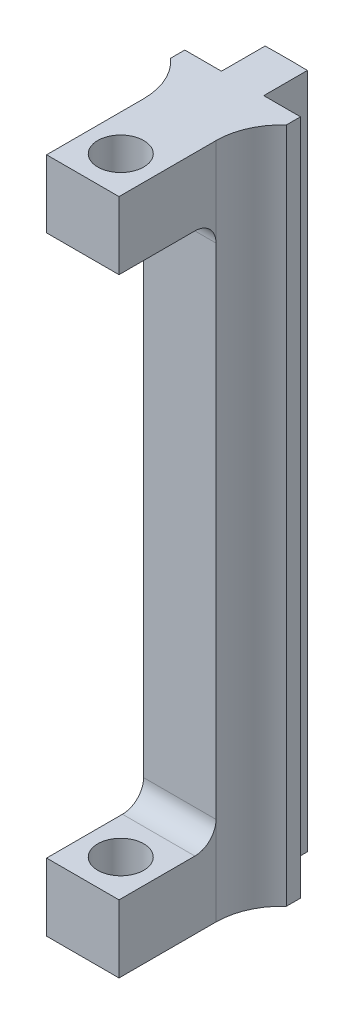
ISO-10303-21;
HEADER;
FILE_DESCRIPTION(('STEP AP214'),'2;1');
FILE_NAME('part.step','',(''),(''),'','','');
FILE_SCHEMA(('AUTOMOTIVE_DESIGN { 1 0 10303 214 1 1 1 1 }'));
ENDSEC;
DATA;
#1=APPLICATION_CONTEXT('core data for automotive mechanical design processes');
#2=APPLICATION_PROTOCOL_DEFINITION('international standard','automotive_design',2000,#1);
#3=PRODUCT_CONTEXT('',#1,'mechanical');
#4=PRODUCT('Part','Part','',(#3));
#5=PRODUCT_RELATED_PRODUCT_CATEGORY('part','',(#4));
#6=PRODUCT_DEFINITION_FORMATION('','',#4);
#7=PRODUCT_DEFINITION_CONTEXT('part definition',#1,'design');
#8=PRODUCT_DEFINITION('design','',#6,#7);
#9=PRODUCT_DEFINITION_SHAPE('','',#8);
#10=(LENGTH_UNIT() NAMED_UNIT(*) SI_UNIT(.MILLI.,.METRE.));
#11=(NAMED_UNIT(*) PLANE_ANGLE_UNIT() SI_UNIT($,.RADIAN.));
#12=(NAMED_UNIT(*) SI_UNIT($,.STERADIAN.) SOLID_ANGLE_UNIT());
#13=UNCERTAINTY_MEASURE_WITH_UNIT(LENGTH_MEASURE(1.E-05),#10,'distance_accuracy_value','');
#14=(GEOMETRIC_REPRESENTATION_CONTEXT(3) GLOBAL_UNCERTAINTY_ASSIGNED_CONTEXT((#13)) GLOBAL_UNIT_ASSIGNED_CONTEXT((#10,
#11,#12)) REPRESENTATION_CONTEXT('',''));
#15=CARTESIAN_POINT('',(0.,0.,0.));
#16=DIRECTION('',(0.,0.,1.));
#17=DIRECTION('',(1.,0.,0.));
#18=AXIS2_PLACEMENT_3D('',#15,#16,#17);
#19=CARTESIAN_POINT('',(-2.71812436418949,-50.8,-75.8154529033946));
#20=DIRECTION('',(0.,0.,1.));
#21=DIRECTION('',(1.,0.,0.));
#22=AXIS2_PLACEMENT_3D('',#19,#20,#21);
#23=PLANE('',#22);
#24=DIRECTION('',(0.,1.,0.));
#25=VECTOR('',#24,1.);
#26=CARTESIAN_POINT('',(-2.71812436418949,-50.8,-75.8154529033946));
#27=LINE('',#26,#25);
#28=CARTESIAN_POINT('',(-2.71812436418949,-44.1325,-75.8154529033946));
#29=VERTEX_POINT('',#28);
#30=CARTESIAN_POINT('',(-2.71812436418949,-6.6675,-75.8154529033946));
#31=VERTEX_POINT('',#30);
#32=EDGE_CURVE('E273',#29,#31,#27,.T.);
#33=ORIENTED_EDGE('',*,*,#32,.F.);
#34=DIRECTION('',(-1.,0.,0.));
#35=VECTOR('',#34,1.);
#36=CARTESIAN_POINT('',(2.71812436418949,-44.1325,-75.8154529033946));
#37=LINE('',#36,#35);
#38=CARTESIAN_POINT('',(2.71812436418949,-44.1325,-75.8154529033946));
#39=VERTEX_POINT('',#38);
#40=EDGE_CURVE('E302',#29,#39,#37,.F.);
#41=ORIENTED_EDGE('',*,*,#40,.T.);
#42=DIRECTION('',(0.,1.,0.));
#43=VECTOR('',#42,1.);
#44=CARTESIAN_POINT('',(2.71812436418949,-50.8,-75.8154529033946));
#45=LINE('',#44,#43);
#46=CARTESIAN_POINT('',(2.71812436418949,-6.6675,-75.8154529033946));
#47=VERTEX_POINT('',#46);
#48=EDGE_CURVE('E283',#39,#47,#45,.T.);
#49=ORIENTED_EDGE('',*,*,#48,.T.);
#50=DIRECTION('',(-1.,0.,0.));
#51=VECTOR('',#50,1.);
#52=CARTESIAN_POINT('',(-2.71812436418949,-6.6675,-75.8154529033946));
#53=LINE('',#52,#51);
#54=EDGE_CURVE('E290',#47,#31,#53,.T.);
#55=ORIENTED_EDGE('',*,*,#54,.T.);
#56=EDGE_LOOP('',(#33,#41,#49,#55));
#57=FACE_BOUND('',#56,.T.);
#58=ADVANCED_FACE('F33',(#57),#23,.T.);
#59=CARTESIAN_POINT('',(-7.64572436418949,-50.8,-75.8154529033946));
#60=DIRECTION('',(0.,1.,0.));
#61=DIRECTION('',(0.,0.,1.));
#62=AXIS2_PLACEMENT_3D('',#59,#60,#61);
#63=CYLINDRICAL_SURFACE('',#62,4.9276);
#64=CARTESIAN_POINT('',(-7.64572436418949,0.,-75.8154529033946));
#65=DIRECTION('',(0.,-1.,0.));
#66=DIRECTION('',(0.,0.,1.));
#67=AXIS2_PLACEMENT_3D('',#64,#65,#66);
#68=CIRCLE('',#67,4.9276);
#69=CARTESIAN_POINT('',(-4.34080980571586,0.,-79.4704195956079));
#70=VERTEX_POINT('',#69);
#71=CARTESIAN_POINT('',(-2.71812436418949,0.,-75.8154529033946));
#72=VERTEX_POINT('',#71);
#73=EDGE_CURVE('E269',#70,#72,#68,.T.);
#74=ORIENTED_EDGE('',*,*,#73,.F.);
#75=DIRECTION('',(0.,1.,0.));
#76=VECTOR('',#75,1.);
#77=CARTESIAN_POINT('',(-4.34080980571586,-50.8,-79.4704195956079));
#78=LINE('',#77,#76);
#79=CARTESIAN_POINT('',(-4.34080980571586,-50.8,-79.4704195956079));
#80=VERTEX_POINT('',#79);
#81=EDGE_CURVE('E255',#70,#80,#78,.F.);
#82=ORIENTED_EDGE('',*,*,#81,.T.);
#83=CARTESIAN_POINT('',(-7.64572436418949,-50.8,-75.8154529033946));
#84=DIRECTION('',(0.,-1.,0.));
#85=DIRECTION('',(0.,0.,1.));
#86=AXIS2_PLACEMENT_3D('',#83,#84,#85);
#87=CIRCLE('',#86,4.9276);
#88=CARTESIAN_POINT('',(-2.71812436418949,-50.8,-75.8154529033946));
#89=VERTEX_POINT('',#88);
#90=EDGE_CURVE('E271',#80,#89,#87,.T.);
#91=ORIENTED_EDGE('',*,*,#90,.T.);
#92=EDGE_CURVE('E49',#89,#29,#27,.T.);
#93=ORIENTED_EDGE('',*,*,#92,.T.);
#94=ORIENTED_EDGE('',*,*,#32,.T.);
#95=DIRECTION('',(0.,1.,0.));
#96=VECTOR('',#95,1.);
#97=CARTESIAN_POINT('',(-2.71812436418949,-5.08,-75.8154529033946));
#98=LINE('',#97,#96);
#99=EDGE_CURVE('E214',#31,#72,#98,.T.);
#100=ORIENTED_EDGE('',*,*,#99,.T.);
#101=EDGE_LOOP('',(#74,#82,#91,#93,#94,#100));
#102=FACE_BOUND('',#101,.T.);
#103=ADVANCED_FACE('F343',(#102),#63,.F.);
#104=CARTESIAN_POINT('',(0.,-50.8,0.));
#105=DIRECTION('',(0.,1.,0.));
#106=DIRECTION('',(0.,0.,1.));
#107=AXIS2_PLACEMENT_3D('',#104,#105,#106);
#108=CYLINDRICAL_SURFACE('',#107,83.82);
#109=CARTESIAN_POINT('',(0.,-50.8,0.));
#110=DIRECTION('',(0.,1.,0.));
#111=DIRECTION('',(0.,0.,1.));
#112=AXIS2_PLACEMENT_3D('',#109,#110,#111);
#113=CIRCLE('',#112,83.82);
#114=CARTESIAN_POINT('',(1.5875,-50.8,-83.8049655077192));
#115=VERTEX_POINT('',#114);
#116=CARTESIAN_POINT('',(-1.5875,-50.8,-83.8049655077192));
#117=VERTEX_POINT('',#116);
#118=EDGE_CURVE('E268',#115,#117,#113,.T.);
#119=ORIENTED_EDGE('',*,*,#118,.T.);
#120=DIRECTION('',(0.,1.,0.));
#121=VECTOR('',#120,1.);
#122=CARTESIAN_POINT('',(-1.5875,-50.8,-83.8049655077192));
#123=LINE('',#122,#121);
#124=CARTESIAN_POINT('',(-1.5875,0.,-83.8049655077192));
#125=VERTEX_POINT('',#124);
#126=EDGE_CURVE('E262',#117,#125,#123,.T.);
#127=ORIENTED_EDGE('',*,*,#126,.T.);
#128=CARTESIAN_POINT('',(0.,0.,0.));
#129=DIRECTION('',(0.,1.,0.));
#130=DIRECTION('',(0.,0.,1.));
#131=AXIS2_PLACEMENT_3D('',#128,#129,#130);
#132=CIRCLE('',#131,83.82);
#133=CARTESIAN_POINT('',(1.5875,0.,-83.8049655077192));
#134=VERTEX_POINT('',#133);
#135=EDGE_CURVE('E276',#134,#125,#132,.T.);
#136=ORIENTED_EDGE('',*,*,#135,.F.);
#137=DIRECTION('',(0.,1.,0.));
#138=VECTOR('',#137,1.);
#139=CARTESIAN_POINT('',(1.5875,-50.8,-83.8049655077192));
#140=LINE('',#139,#138);
#141=EDGE_CURVE('E238',#115,#134,#140,.T.);
#142=ORIENTED_EDGE('',*,*,#141,.F.);
#143=EDGE_LOOP('',(#119,#127,#136,#142));
#144=FACE_BOUND('',#143,.T.);
#145=ADVANCED_FACE('F374',(#144),#108,.T.);
#146=CARTESIAN_POINT('',(7.64572436418949,-50.8,-75.8154529033946));
#147=DIRECTION('',(0.,-1.,0.));
#148=DIRECTION('',(0.,0.,-1.));
#149=AXIS2_PLACEMENT_3D('',#146,#147,#148);
#150=PLANE('',#149);
#151=CARTESIAN_POINT('',(0.,-50.8,-71.3797296215661));
#152=DIRECTION('',(0.,1.,0.));
#153=DIRECTION('',(0.,0.,1.));
#154=AXIS2_PLACEMENT_3D('',#151,#152,#153);
#155=CIRCLE('',#154,1.72719999999999);
#156=CARTESIAN_POINT('',(0.,-50.8,-69.6525296215661));
#157=VERTEX_POINT('',#156);
#158=EDGE_CURVE('E440',#157,#157,#155,.T.);
#159=ORIENTED_EDGE('',*,*,#158,.T.);
#160=EDGE_LOOP('',(#159));
#161=FACE_BOUND('',#160,.T.);
#162=DIRECTION('',(0.,0.,-1.));
#163=VECTOR('',#162,1.);
#164=CARTESIAN_POINT('',(1.5875,-50.8,-75.8154529033946));
#165=LINE('',#164,#163);
#166=CARTESIAN_POINT('',(1.5875,-50.8,-80.5280907213787));
#167=VERTEX_POINT('',#166);
#168=EDGE_CURVE('E235',#167,#115,#165,.T.);
#169=ORIENTED_EDGE('',*,*,#168,.F.);
#170=DIRECTION('',(-1.,0.,0.));
#171=VECTOR('',#170,1.);
#172=CARTESIAN_POINT('',(7.64572436418949,-50.8,-80.5280907213787));
#173=LINE('',#172,#171);
#174=CARTESIAN_POINT('',(4.34080980571586,-50.8,-80.5280907213787));
#175=VERTEX_POINT('',#174);
#176=EDGE_CURVE('E232',#175,#167,#173,.T.);
#177=ORIENTED_EDGE('',*,*,#176,.F.);
#178=DIRECTION('',(0.,0.,-1.));
#179=VECTOR('',#178,1.);
#180=CARTESIAN_POINT('',(4.34080980571586,-50.8,-75.8154529033946));
#181=LINE('',#180,#179);
#182=CARTESIAN_POINT('',(4.34080980571586,-50.8,-79.4704195956079));
#183=VERTEX_POINT('',#182);
#184=EDGE_CURVE('E224',#183,#175,#181,.T.);
#185=ORIENTED_EDGE('',*,*,#184,.F.);
#186=CARTESIAN_POINT('',(7.64572436418949,-50.8,-75.8154529033946));
#187=DIRECTION('',(0.,-1.,0.));
#188=DIRECTION('',(0.,0.,-1.));
#189=AXIS2_PLACEMENT_3D('',#186,#187,#188);
#190=CIRCLE('',#189,4.9276);
#191=CARTESIAN_POINT('',(2.71812436418949,-50.8,-75.8154529033946));
#192=VERTEX_POINT('',#191);
#193=EDGE_CURVE('E266',#192,#183,#190,.T.);
#194=ORIENTED_EDGE('',*,*,#193,.F.);
#195=DIRECTION('',(0.,0.,-1.));
#196=VECTOR('',#195,1.);
#197=CARTESIAN_POINT('',(2.71812436418949,-50.8,-75.8154529033946));
#198=LINE('',#197,#196);
#199=CARTESIAN_POINT('',(2.7181243641895,-50.8,-68.5315063397377));
#200=VERTEX_POINT('',#199);
#201=EDGE_CURVE('E187',#200,#192,#198,.T.);
#202=ORIENTED_EDGE('',*,*,#201,.F.);
#203=DIRECTION('',(1.,0.,0.));
#204=VECTOR('',#203,1.);
#205=CARTESIAN_POINT('',(2.7181243641895,-50.8,-68.5315063397377));
#206=LINE('',#205,#204);
#207=CARTESIAN_POINT('',(-2.71812436418949,-50.8,-68.5315063397377));
#208=VERTEX_POINT('',#207);
#209=EDGE_CURVE('E171',#208,#200,#206,.T.);
#210=ORIENTED_EDGE('',*,*,#209,.F.);
#211=DIRECTION('',(0.,0.,1.));
#212=VECTOR('',#211,1.);
#213=CARTESIAN_POINT('',(-2.71812436418949,-50.8,-75.8154529033946));
#214=LINE('',#213,#212);
#215=EDGE_CURVE('E179',#89,#208,#214,.T.);
#216=ORIENTED_EDGE('',*,*,#215,.F.);
#217=ORIENTED_EDGE('',*,*,#90,.F.);
#218=DIRECTION('',(0.,0.,-1.));
#219=VECTOR('',#218,1.);
#220=CARTESIAN_POINT('',(-4.34080980571586,-50.8,-75.8154529033946));
#221=LINE('',#220,#219);
#222=CARTESIAN_POINT('',(-4.34080980571586,-50.8,-80.5280907213787));
#223=VERTEX_POINT('',#222);
#224=EDGE_CURVE('E249',#80,#223,#221,.T.);
#225=ORIENTED_EDGE('',*,*,#224,.T.);
#226=DIRECTION('',(1.,0.,0.));
#227=VECTOR('',#226,1.);
#228=CARTESIAN_POINT('',(7.64572436418949,-50.8,-80.5280907213787));
#229=LINE('',#228,#227);
#230=CARTESIAN_POINT('',(-1.5875,-50.8,-80.5280907213787));
#231=VERTEX_POINT('',#230);
#232=EDGE_CURVE('E257',#223,#231,#229,.T.);
#233=ORIENTED_EDGE('',*,*,#232,.T.);
#234=DIRECTION('',(0.,0.,-1.));
#235=VECTOR('',#234,1.);
#236=CARTESIAN_POINT('',(-1.5875,-50.8,-75.8154529033946));
#237=LINE('',#236,#235);
#238=EDGE_CURVE('E259',#231,#117,#237,.T.);
#239=ORIENTED_EDGE('',*,*,#238,.T.);
#240=ORIENTED_EDGE('',*,*,#118,.F.);
#241=EDGE_LOOP('',(#169,#177,#185,#194,#202,#210,#216,#217,#225,#233,#239,#240));
#242=FACE_BOUND('',#241,.T.);
#243=ADVANCED_FACE('F351',(#161,#242),#150,.T.);
#244=CARTESIAN_POINT('',(7.64572436418949,0.,-75.8154529033946));
#245=DIRECTION('',(0.,-1.,0.));
#246=DIRECTION('',(0.,0.,-1.));
#247=AXIS2_PLACEMENT_3D('',#244,#245,#246);
#248=PLANE('',#247);
#249=CARTESIAN_POINT('',(0.,0.,-71.3797296215661));
#250=DIRECTION('',(0.,1.,0.));
#251=DIRECTION('',(0.,0.,1.));
#252=AXIS2_PLACEMENT_3D('',#249,#250,#251);
#253=CIRCLE('',#252,1.72719999999999);
#254=CARTESIAN_POINT('',(0.,0.,-69.6525296215661));
#255=VERTEX_POINT('',#254);
#256=EDGE_CURVE('E441',#255,#255,#253,.T.);
#257=ORIENTED_EDGE('',*,*,#256,.F.);
#258=EDGE_LOOP('',(#257));
#259=FACE_BOUND('',#258,.T.);
#260=DIRECTION('',(-1.,0.,0.));
#261=VECTOR('',#260,1.);
#262=CARTESIAN_POINT('',(4.34080980571586,0.,-80.5280907213787));
#263=LINE('',#262,#261);
#264=CARTESIAN_POINT('',(4.34080980571586,0.,-80.5280907213787));
#265=VERTEX_POINT('',#264);
#266=CARTESIAN_POINT('',(1.5875,0.,-80.5280907213787));
#267=VERTEX_POINT('',#266);
#268=EDGE_CURVE('E218',#265,#267,#263,.T.);
#269=ORIENTED_EDGE('',*,*,#268,.T.);
#270=DIRECTION('',(0.,0.,-1.));
#271=VECTOR('',#270,1.);
#272=CARTESIAN_POINT('',(1.5875,0.,-83.82));
#273=LINE('',#272,#271);
#274=EDGE_CURVE('E222',#267,#134,#273,.T.);
#275=ORIENTED_EDGE('',*,*,#274,.T.);
#276=ORIENTED_EDGE('',*,*,#135,.T.);
#277=DIRECTION('',(0.,0.,-1.));
#278=VECTOR('',#277,1.);
#279=CARTESIAN_POINT('',(-1.5875,0.,-83.82));
#280=LINE('',#279,#278);
#281=CARTESIAN_POINT('',(-1.5875,0.,-80.5280907213787));
#282=VERTEX_POINT('',#281);
#283=EDGE_CURVE('E246',#282,#125,#280,.T.);
#284=ORIENTED_EDGE('',*,*,#283,.F.);
#285=DIRECTION('',(1.,0.,0.));
#286=VECTOR('',#285,1.);
#287=CARTESIAN_POINT('',(-4.34080980571586,0.,-80.5280907213787));
#288=LINE('',#287,#286);
#289=CARTESIAN_POINT('',(-4.34080980571586,0.,-80.5280907213787));
#290=VERTEX_POINT('',#289);
#291=EDGE_CURVE('E242',#290,#282,#288,.T.);
#292=ORIENTED_EDGE('',*,*,#291,.F.);
#293=DIRECTION('',(0.,0.,-1.));
#294=VECTOR('',#293,1.);
#295=CARTESIAN_POINT('',(-4.34080980571586,0.,-75.8154529033946));
#296=LINE('',#295,#294);
#297=EDGE_CURVE('E282',#70,#290,#296,.T.);
#298=ORIENTED_EDGE('',*,*,#297,.F.);
#299=ORIENTED_EDGE('',*,*,#73,.T.);
#300=DIRECTION('',(0.,0.,1.));
#301=VECTOR('',#300,1.);
#302=CARTESIAN_POINT('',(-2.71812436418949,0.,-75.8154529033946));
#303=LINE('',#302,#301);
#304=CARTESIAN_POINT('',(-2.71812436418949,0.,-68.5315063397377));
#305=VERTEX_POINT('',#304);
#306=EDGE_CURVE('E204',#72,#305,#303,.T.);
#307=ORIENTED_EDGE('',*,*,#306,.T.);
#308=DIRECTION('',(1.,0.,0.));
#309=VECTOR('',#308,1.);
#310=CARTESIAN_POINT('',(2.7181243641895,0.,-68.5315063397377));
#311=LINE('',#310,#309);
#312=CARTESIAN_POINT('',(2.7181243641895,0.,-68.5315063397377));
#313=VERTEX_POINT('',#312);
#314=EDGE_CURVE('E196',#305,#313,#311,.T.);
#315=ORIENTED_EDGE('',*,*,#314,.T.);
#316=DIRECTION('',(0.,0.,-1.));
#317=VECTOR('',#316,1.);
#318=CARTESIAN_POINT('',(2.71812436418949,0.,-75.8154529033946));
#319=LINE('',#318,#317);
#320=CARTESIAN_POINT('',(2.71812436418949,0.,-75.8154529033946));
#321=VERTEX_POINT('',#320);
#322=EDGE_CURVE('E190',#313,#321,#319,.T.);
#323=ORIENTED_EDGE('',*,*,#322,.T.);
#324=CARTESIAN_POINT('',(7.64572436418949,0.,-75.8154529033946));
#325=DIRECTION('',(0.,-1.,0.));
#326=DIRECTION('',(0.,0.,-1.));
#327=AXIS2_PLACEMENT_3D('',#324,#325,#326);
#328=CIRCLE('',#327,4.9276);
#329=CARTESIAN_POINT('',(4.34080980571586,0.,-79.4704195956079));
#330=VERTEX_POINT('',#329);
#331=EDGE_CURVE('E265',#321,#330,#328,.T.);
#332=ORIENTED_EDGE('',*,*,#331,.T.);
#333=DIRECTION('',(0.,0.,-1.));
#334=VECTOR('',#333,1.);
#335=CARTESIAN_POINT('',(4.34080980571586,0.,-80.5280907213787));
#336=LINE('',#335,#334);
#337=EDGE_CURVE('E211',#330,#265,#336,.T.);
#338=ORIENTED_EDGE('',*,*,#337,.T.);
#339=EDGE_LOOP('',(#269,#275,#276,#284,#292,#298,#299,#307,#315,#323,#332,#338));
#340=FACE_BOUND('',#339,.T.);
#341=ADVANCED_FACE('F340',(#259,#340),#248,.F.);
#342=CARTESIAN_POINT('',(7.64572436418949,-50.8,-75.8154529033946));
#343=DIRECTION('',(0.,1.,0.));
#344=DIRECTION('',(0.,0.,1.));
#345=AXIS2_PLACEMENT_3D('',#342,#343,#344);
#346=CYLINDRICAL_SURFACE('',#345,4.9276);
#347=DIRECTION('',(0.,1.,0.));
#348=VECTOR('',#347,1.);
#349=CARTESIAN_POINT('',(4.34080980571586,-50.8,-79.4704195956079));
#350=LINE('',#349,#348);
#351=EDGE_CURVE('E287',#330,#183,#350,.F.);
#352=ORIENTED_EDGE('',*,*,#351,.F.);
#353=ORIENTED_EDGE('',*,*,#331,.F.);
#354=DIRECTION('',(0.,1.,0.));
#355=VECTOR('',#354,1.);
#356=CARTESIAN_POINT('',(2.71812436418949,-5.08,-75.8154529033946));
#357=LINE('',#356,#355);
#358=EDGE_CURVE('E201',#47,#321,#357,.T.);
#359=ORIENTED_EDGE('',*,*,#358,.F.);
#360=ORIENTED_EDGE('',*,*,#48,.F.);
#361=EDGE_CURVE('E280',#192,#39,#45,.T.);
#362=ORIENTED_EDGE('',*,*,#361,.F.);
#363=ORIENTED_EDGE('',*,*,#193,.T.);
#364=EDGE_LOOP('',(#352,#353,#359,#360,#362,#363));
#365=FACE_BOUND('',#364,.T.);
#366=ADVANCED_FACE('F315',(#365),#346,.F.);
#367=CARTESIAN_POINT('',(-1.5875,0.,-83.82));
#368=DIRECTION('',(-1.,0.,0.));
#369=DIRECTION('',(0.,0.,1.));
#370=AXIS2_PLACEMENT_3D('',#367,#368,#369);
#371=PLANE('',#370);
#372=ORIENTED_EDGE('',*,*,#126,.F.);
#373=ORIENTED_EDGE('',*,*,#238,.F.);
#374=DIRECTION('',(0.,-1.,0.));
#375=VECTOR('',#374,1.);
#376=CARTESIAN_POINT('',(-1.5875,0.,-80.5280907213787));
#377=LINE('',#376,#375);
#378=EDGE_CURVE('E245',#282,#231,#377,.T.);
#379=ORIENTED_EDGE('',*,*,#378,.F.);
#380=ORIENTED_EDGE('',*,*,#283,.T.);
#381=EDGE_LOOP('',(#372,#373,#379,#380));
#382=FACE_BOUND('',#381,.T.);
#383=ADVANCED_FACE('F358',(#382),#371,.T.);
#384=CARTESIAN_POINT('',(-4.34080980571586,0.,-80.5280907213787));
#385=DIRECTION('',(0.,0.,-1.));
#386=DIRECTION('',(-1.,0.,0.));
#387=AXIS2_PLACEMENT_3D('',#384,#385,#386);
#388=PLANE('',#387);
#389=ORIENTED_EDGE('',*,*,#232,.F.);
#390=DIRECTION('',(0.,-1.,0.));
#391=VECTOR('',#390,1.);
#392=CARTESIAN_POINT('',(-4.34080980571586,0.,-80.5280907213787));
#393=LINE('',#392,#391);
#394=EDGE_CURVE('E241',#290,#223,#393,.T.);
#395=ORIENTED_EDGE('',*,*,#394,.F.);
#396=ORIENTED_EDGE('',*,*,#291,.T.);
#397=ORIENTED_EDGE('',*,*,#378,.T.);
#398=EDGE_LOOP('',(#389,#395,#396,#397));
#399=FACE_BOUND('',#398,.T.);
#400=ADVANCED_FACE('F354',(#399),#388,.T.);
#401=CARTESIAN_POINT('',(-4.34080980571586,0.,-80.5280907213787));
#402=DIRECTION('',(-1.,0.,0.));
#403=DIRECTION('',(0.,0.,1.));
#404=AXIS2_PLACEMENT_3D('',#401,#402,#403);
#405=PLANE('',#404);
#406=ORIENTED_EDGE('',*,*,#81,.F.);
#407=ORIENTED_EDGE('',*,*,#297,.T.);
#408=ORIENTED_EDGE('',*,*,#394,.T.);
#409=ORIENTED_EDGE('',*,*,#224,.F.);
#410=EDGE_LOOP('',(#406,#407,#408,#409));
#411=FACE_BOUND('',#410,.T.);
#412=ADVANCED_FACE('F347',(#411),#405,.T.);
#413=CARTESIAN_POINT('',(1.5875,0.,-83.82));
#414=DIRECTION('',(-1.,0.,0.));
#415=DIRECTION('',(0.,0.,1.));
#416=AXIS2_PLACEMENT_3D('',#413,#414,#415);
#417=PLANE('',#416);
#418=ORIENTED_EDGE('',*,*,#168,.T.);
#419=ORIENTED_EDGE('',*,*,#141,.T.);
#420=ORIENTED_EDGE('',*,*,#274,.F.);
#421=DIRECTION('',(0.,-1.,0.));
#422=VECTOR('',#421,1.);
#423=CARTESIAN_POINT('',(1.5875,0.,-80.5280907213787));
#424=LINE('',#423,#422);
#425=EDGE_CURVE('E220',#267,#167,#424,.T.);
#426=ORIENTED_EDGE('',*,*,#425,.T.);
#427=EDGE_LOOP('',(#418,#419,#420,#426));
#428=FACE_BOUND('',#427,.T.);
#429=ADVANCED_FACE('F362',(#428),#417,.F.);
#430=CARTESIAN_POINT('',(4.34080980571586,0.,-80.5280907213787));
#431=DIRECTION('',(0.,0.,1.));
#432=DIRECTION('',(1.,0.,0.));
#433=AXIS2_PLACEMENT_3D('',#430,#431,#432);
#434=PLANE('',#433);
#435=DIRECTION('',(0.,-1.,0.));
#436=VECTOR('',#435,1.);
#437=CARTESIAN_POINT('',(4.34080980571586,0.,-80.5280907213787));
#438=LINE('',#437,#436);
#439=EDGE_CURVE('E221',#265,#175,#438,.T.);
#440=ORIENTED_EDGE('',*,*,#439,.T.);
#441=ORIENTED_EDGE('',*,*,#176,.T.);
#442=ORIENTED_EDGE('',*,*,#425,.F.);
#443=ORIENTED_EDGE('',*,*,#268,.F.);
#444=EDGE_LOOP('',(#440,#441,#442,#443));
#445=FACE_BOUND('',#444,.T.);
#446=ADVANCED_FACE('F367',(#445),#434,.F.);
#447=CARTESIAN_POINT('',(4.34080980571586,0.,-80.5280907213787));
#448=DIRECTION('',(-1.,0.,0.));
#449=DIRECTION('',(0.,0.,1.));
#450=AXIS2_PLACEMENT_3D('',#447,#448,#449);
#451=PLANE('',#450);
#452=ORIENTED_EDGE('',*,*,#351,.T.);
#453=ORIENTED_EDGE('',*,*,#184,.T.);
#454=ORIENTED_EDGE('',*,*,#439,.F.);
#455=ORIENTED_EDGE('',*,*,#337,.F.);
#456=EDGE_LOOP('',(#452,#453,#454,#455));
#457=FACE_BOUND('',#456,.T.);
#458=ADVANCED_FACE('F371',(#457),#451,.F.);
#459=CARTESIAN_POINT('',(2.71812436418949,-5.08,-75.8154529033946));
#460=DIRECTION('',(1.,0.,0.));
#461=DIRECTION('',(0.,0.,-1.));
#462=AXIS2_PLACEMENT_3D('',#459,#460,#461);
#463=PLANE('',#462);
#464=ORIENTED_EDGE('',*,*,#322,.F.);
#465=DIRECTION('',(0.,1.,0.));
#466=VECTOR('',#465,1.);
#467=CARTESIAN_POINT('',(2.7181243641895,-5.08,-68.5315063397377));
#468=LINE('',#467,#466);
#469=CARTESIAN_POINT('',(2.7181243641895,-5.08,-68.5315063397377));
#470=VERTEX_POINT('',#469);
#471=EDGE_CURVE('E209',#470,#313,#468,.T.);
#472=ORIENTED_EDGE('',*,*,#471,.F.);
#473=DIRECTION('',(0.,0.,-1.));
#474=VECTOR('',#473,1.);
#475=CARTESIAN_POINT('',(2.71812436418949,-5.08,-75.8154529033946));
#476=LINE('',#475,#474);
#477=CARTESIAN_POINT('',(2.71812436418949,-5.08,-74.2279529033946));
#478=VERTEX_POINT('',#477);
#479=EDGE_CURVE('E192',#470,#478,#476,.T.);
#480=ORIENTED_EDGE('',*,*,#479,.T.);
#481=CARTESIAN_POINT('',(2.71812436418949,-6.6675,-74.2279529033946));
#482=DIRECTION('',(1.,0.,0.));
#483=DIRECTION('',(0.,0.,-1.));
#484=AXIS2_PLACEMENT_3D('',#481,#482,#483);
#485=CIRCLE('',#484,1.5875);
#486=EDGE_CURVE('E297',#478,#47,#485,.F.);
#487=ORIENTED_EDGE('',*,*,#486,.T.);
#488=ORIENTED_EDGE('',*,*,#358,.T.);
#489=EDGE_LOOP('',(#464,#472,#480,#487,#488));
#490=FACE_BOUND('',#489,.T.);
#491=ADVANCED_FACE('F322',(#490),#463,.T.);
#492=CARTESIAN_POINT('',(2.7181243641895,-5.08,-68.5315063397377));
#493=DIRECTION('',(0.,0.,1.));
#494=DIRECTION('',(1.,0.,0.));
#495=AXIS2_PLACEMENT_3D('',#492,#493,#494);
#496=PLANE('',#495);
#497=ORIENTED_EDGE('',*,*,#314,.F.);
#498=DIRECTION('',(0.,1.,0.));
#499=VECTOR('',#498,1.);
#500=CARTESIAN_POINT('',(-2.71812436418949,-5.08,-68.5315063397377));
#501=LINE('',#500,#499);
#502=CARTESIAN_POINT('',(-2.71812436418949,-5.08,-68.5315063397377));
#503=VERTEX_POINT('',#502);
#504=EDGE_CURVE('E212',#503,#305,#501,.T.);
#505=ORIENTED_EDGE('',*,*,#504,.F.);
#506=DIRECTION('',(1.,0.,0.));
#507=VECTOR('',#506,1.);
#508=CARTESIAN_POINT('',(2.7181243641895,-5.08,-68.5315063397377));
#509=LINE('',#508,#507);
#510=EDGE_CURVE('E198',#503,#470,#509,.T.);
#511=ORIENTED_EDGE('',*,*,#510,.T.);
#512=ORIENTED_EDGE('',*,*,#471,.T.);
#513=EDGE_LOOP('',(#497,#505,#511,#512));
#514=FACE_BOUND('',#513,.T.);
#515=ADVANCED_FACE('F338',(#514),#496,.T.);
#516=CARTESIAN_POINT('',(-2.71812436418949,-5.08,-75.8154529033946));
#517=DIRECTION('',(-1.,0.,0.));
#518=DIRECTION('',(0.,0.,1.));
#519=AXIS2_PLACEMENT_3D('',#516,#517,#518);
#520=PLANE('',#519);
#521=ORIENTED_EDGE('',*,*,#306,.F.);
#522=ORIENTED_EDGE('',*,*,#99,.F.);
#523=CARTESIAN_POINT('',(-2.71812436418949,-6.6675,-74.2279529033946));
#524=DIRECTION('',(-1.,0.,0.));
#525=DIRECTION('',(0.,0.,1.));
#526=AXIS2_PLACEMENT_3D('',#523,#524,#525);
#527=CIRCLE('',#526,1.5875);
#528=CARTESIAN_POINT('',(-2.71812436418949,-5.08,-74.2279529033946));
#529=VERTEX_POINT('',#528);
#530=EDGE_CURVE('E295',#31,#529,#527,.F.);
#531=ORIENTED_EDGE('',*,*,#530,.T.);
#532=DIRECTION('',(0.,0.,1.));
#533=VECTOR('',#532,1.);
#534=CARTESIAN_POINT('',(-2.71812436418949,-5.08,-75.8154529033946));
#535=LINE('',#534,#533);
#536=EDGE_CURVE('E195',#529,#503,#535,.T.);
#537=ORIENTED_EDGE('',*,*,#536,.T.);
#538=ORIENTED_EDGE('',*,*,#504,.T.);
#539=EDGE_LOOP('',(#521,#522,#531,#537,#538));
#540=FACE_BOUND('',#539,.T.);
#541=ADVANCED_FACE('F331',(#540),#520,.T.);
#542=CARTESIAN_POINT('',(0.,-5.08,0.));
#543=DIRECTION('',(0.,-1.,0.));
#544=DIRECTION('',(0.,0.,-1.));
#545=AXIS2_PLACEMENT_3D('',#542,#543,#544);
#546=PLANE('',#545);
#547=CARTESIAN_POINT('',(0.,-5.08,-71.3797296215661));
#548=DIRECTION('',(0.,-1.,0.));
#549=DIRECTION('',(0.,0.,-1.));
#550=AXIS2_PLACEMENT_3D('',#547,#548,#549);
#551=CIRCLE('',#550,1.72719999999999);
#552=CARTESIAN_POINT('',(0.,-5.08,-73.1069296215661));
#553=VERTEX_POINT('',#552);
#554=EDGE_CURVE('E183',#553,#553,#551,.T.);
#555=ORIENTED_EDGE('',*,*,#554,.F.);
#556=EDGE_LOOP('',(#555));
#557=FACE_BOUND('',#556,.T.);
#558=ORIENTED_EDGE('',*,*,#536,.F.);
#559=DIRECTION('',(-1.,0.,0.));
#560=VECTOR('',#559,1.);
#561=CARTESIAN_POINT('',(2.71812436418949,-5.08,-74.2279529033946));
#562=LINE('',#561,#560);
#563=EDGE_CURVE('E293',#529,#478,#562,.F.);
#564=ORIENTED_EDGE('',*,*,#563,.T.);
#565=ORIENTED_EDGE('',*,*,#479,.F.);
#566=ORIENTED_EDGE('',*,*,#510,.F.);
#567=EDGE_LOOP('',(#558,#564,#565,#566));
#568=FACE_BOUND('',#567,.T.);
#569=ADVANCED_FACE('F335',(#557,#568),#546,.T.);
#570=CARTESIAN_POINT('',(-2.71812436418949,-6.6675,-74.2279529033946));
#571=DIRECTION('',(1.,0.,0.));
#572=DIRECTION('',(0.,0.,-1.));
#573=AXIS2_PLACEMENT_3D('',#570,#571,#572);
#574=CYLINDRICAL_SURFACE('',#573,1.5875);
#575=ORIENTED_EDGE('',*,*,#486,.F.);
#576=ORIENTED_EDGE('',*,*,#563,.F.);
#577=ORIENTED_EDGE('',*,*,#530,.F.);
#578=ORIENTED_EDGE('',*,*,#54,.F.);
#579=EDGE_LOOP('',(#575,#576,#577,#578));
#580=FACE_BOUND('',#579,.T.);
#581=ADVANCED_FACE('F327',(#580),#574,.F.);
#582=CARTESIAN_POINT('',(2.71812436418949,-45.72,-75.8154529033946));
#583=DIRECTION('',(-1.,0.,0.));
#584=DIRECTION('',(0.,0.,1.));
#585=AXIS2_PLACEMENT_3D('',#582,#583,#584);
#586=PLANE('',#585);
#587=ORIENTED_EDGE('',*,*,#201,.T.);
#588=ORIENTED_EDGE('',*,*,#361,.T.);
#589=CARTESIAN_POINT('',(2.71812436418949,-44.1325,-74.2279529033946));
#590=DIRECTION('',(-1.,0.,0.));
#591=DIRECTION('',(0.,0.,1.));
#592=AXIS2_PLACEMENT_3D('',#589,#590,#591);
#593=CIRCLE('',#592,1.5875);
#594=CARTESIAN_POINT('',(2.71812436418949,-45.72,-74.2279529033946));
#595=VERTEX_POINT('',#594);
#596=EDGE_CURVE('E11',#39,#595,#593,.T.);
#597=ORIENTED_EDGE('',*,*,#596,.T.);
#598=DIRECTION('',(0.,0.,-1.));
#599=VECTOR('',#598,1.);
#600=CARTESIAN_POINT('',(2.71812436418949,-45.72,-75.8154529033946));
#601=LINE('',#600,#599);
#602=CARTESIAN_POINT('',(2.7181243641895,-45.72,-68.5315063397377));
#603=VERTEX_POINT('',#602);
#604=EDGE_CURVE('E159',#603,#595,#601,.T.);
#605=ORIENTED_EDGE('',*,*,#604,.F.);
#606=DIRECTION('',(0.,-1.,0.));
#607=VECTOR('',#606,1.);
#608=CARTESIAN_POINT('',(2.7181243641895,-45.72,-68.5315063397377));
#609=LINE('',#608,#607);
#610=EDGE_CURVE('E168',#603,#200,#609,.T.);
#611=ORIENTED_EDGE('',*,*,#610,.T.);
#612=EDGE_LOOP('',(#587,#588,#597,#605,#611));
#613=FACE_BOUND('',#612,.T.);
#614=ADVANCED_FACE('F177',(#613),#586,.F.);
#615=CARTESIAN_POINT('',(-2.71812436418949,-45.72,-75.8154529033946));
#616=DIRECTION('',(1.,0.,0.));
#617=DIRECTION('',(0.,0.,-1.));
#618=AXIS2_PLACEMENT_3D('',#615,#616,#617);
#619=PLANE('',#618);
#620=ORIENTED_EDGE('',*,*,#215,.T.);
#621=DIRECTION('',(0.,-1.,0.));
#622=VECTOR('',#621,1.);
#623=CARTESIAN_POINT('',(-2.71812436418949,-45.72,-68.5315063397377));
#624=LINE('',#623,#622);
#625=CARTESIAN_POINT('',(-2.71812436418949,-45.72,-68.5315063397377));
#626=VERTEX_POINT('',#625);
#627=EDGE_CURVE('E175',#626,#208,#624,.T.);
#628=ORIENTED_EDGE('',*,*,#627,.F.);
#629=DIRECTION('',(0.,0.,1.));
#630=VECTOR('',#629,1.);
#631=CARTESIAN_POINT('',(-2.71812436418949,-45.72,-75.8154529033946));
#632=LINE('',#631,#630);
#633=CARTESIAN_POINT('',(-2.71812436418949,-45.72,-74.2279529033946));
#634=VERTEX_POINT('',#633);
#635=EDGE_CURVE('E162',#634,#626,#632,.T.);
#636=ORIENTED_EDGE('',*,*,#635,.F.);
#637=CARTESIAN_POINT('',(-2.71812436418949,-44.1325,-74.2279529033946));
#638=DIRECTION('',(1.,0.,0.));
#639=DIRECTION('',(0.,0.,-1.));
#640=AXIS2_PLACEMENT_3D('',#637,#638,#639);
#641=CIRCLE('',#640,1.5875);
#642=EDGE_CURVE('E43',#634,#29,#641,.T.);
#643=ORIENTED_EDGE('',*,*,#642,.T.);
#644=ORIENTED_EDGE('',*,*,#92,.F.);
#645=EDGE_LOOP('',(#620,#628,#636,#643,#644));
#646=FACE_BOUND('',#645,.T.);
#647=ADVANCED_FACE('F308',(#646),#619,.F.);
#648=CARTESIAN_POINT('',(2.7181243641895,-45.72,-68.5315063397377));
#649=DIRECTION('',(0.,0.,-1.));
#650=DIRECTION('',(-1.,0.,0.));
#651=AXIS2_PLACEMENT_3D('',#648,#649,#650);
#652=PLANE('',#651);
#653=ORIENTED_EDGE('',*,*,#209,.T.);
#654=ORIENTED_EDGE('',*,*,#610,.F.);
#655=DIRECTION('',(1.,0.,0.));
#656=VECTOR('',#655,1.);
#657=CARTESIAN_POINT('',(2.7181243641895,-45.72,-68.5315063397377));
#658=LINE('',#657,#656);
#659=EDGE_CURVE('E154',#626,#603,#658,.T.);
#660=ORIENTED_EDGE('',*,*,#659,.F.);
#661=ORIENTED_EDGE('',*,*,#627,.T.);
#662=EDGE_LOOP('',(#653,#654,#660,#661));
#663=FACE_BOUND('',#662,.T.);
#664=ADVANCED_FACE('F169',(#663),#652,.F.);
#665=CARTESIAN_POINT('',(0.,-45.72,0.));
#666=DIRECTION('',(0.,1.,0.));
#667=DIRECTION('',(0.,0.,-1.));
#668=AXIS2_PLACEMENT_3D('',#665,#666,#667);
#669=PLANE('',#668);
#670=CARTESIAN_POINT('',(0.,-45.72,-71.3797296215661));
#671=DIRECTION('',(0.,1.,0.));
#672=DIRECTION('',(0.,0.,1.));
#673=AXIS2_PLACEMENT_3D('',#670,#671,#672);
#674=CIRCLE('',#673,1.72719999999999);
#675=CARTESIAN_POINT('',(0.,-45.72,-69.6525296215661));
#676=VERTEX_POINT('',#675);
#677=EDGE_CURVE('E37',#676,#676,#674,.T.);
#678=ORIENTED_EDGE('',*,*,#677,.F.);
#679=EDGE_LOOP('',(#678));
#680=FACE_BOUND('',#679,.T.);
#681=ORIENTED_EDGE('',*,*,#604,.T.);
#682=DIRECTION('',(-1.,0.,0.));
#683=VECTOR('',#682,1.);
#684=CARTESIAN_POINT('',(-2.71812436418949,-45.72,-74.2279529033946));
#685=LINE('',#684,#683);
#686=EDGE_CURVE('E300',#595,#634,#685,.T.);
#687=ORIENTED_EDGE('',*,*,#686,.T.);
#688=ORIENTED_EDGE('',*,*,#635,.T.);
#689=ORIENTED_EDGE('',*,*,#659,.T.);
#690=EDGE_LOOP('',(#681,#687,#688,#689));
#691=FACE_BOUND('',#690,.T.);
#692=ADVANCED_FACE('F156',(#680,#691),#669,.T.);
#693=CARTESIAN_POINT('',(0.,-44.1325,-74.2279529033946));
#694=DIRECTION('',(1.,0.,0.));
#695=DIRECTION('',(0.,0.,-1.));
#696=AXIS2_PLACEMENT_3D('',#693,#694,#695);
#697=CYLINDRICAL_SURFACE('',#696,1.5875);
#698=ORIENTED_EDGE('',*,*,#596,.F.);
#699=ORIENTED_EDGE('',*,*,#40,.F.);
#700=ORIENTED_EDGE('',*,*,#642,.F.);
#701=ORIENTED_EDGE('',*,*,#686,.F.);
#702=EDGE_LOOP('',(#698,#699,#700,#701));
#703=FACE_BOUND('',#702,.T.);
#704=ADVANCED_FACE('F35',(#703),#697,.F.);
#705=CARTESIAN_POINT('',(0.,0.,-71.3797296215661));
#706=DIRECTION('',(0.,1.,0.));
#707=DIRECTION('',(0.,0.,1.));
#708=AXIS2_PLACEMENT_3D('',#705,#706,#707);
#709=CYLINDRICAL_SURFACE('',#708,1.72719999999999);
#710=ORIENTED_EDGE('',*,*,#677,.T.);
#711=EDGE_LOOP('',(#710));
#712=FACE_BOUND('',#711,.T.);
#713=ORIENTED_EDGE('',*,*,#158,.F.);
#714=EDGE_LOOP('',(#713));
#715=FACE_BOUND('',#714,.T.);
#716=ADVANCED_FACE('F426',(#712,#715),#709,.F.);
#717=ORIENTED_EDGE('',*,*,#554,.T.);
#718=EDGE_LOOP('',(#717));
#719=FACE_BOUND('',#718,.T.);
#720=ORIENTED_EDGE('',*,*,#256,.T.);
#721=EDGE_LOOP('',(#720));
#722=FACE_BOUND('',#721,.T.);
#723=ADVANCED_FACE('F428',(#719,#722),#709,.F.);
#724=CLOSED_SHELL('',(#58,#103,#145,#243,#341,#366,#383,#400,#412,#429,#446,#458,#491,#515,#541,
#569,#581,#614,#647,#664,#692,#704,#716,#723));
#725=MANIFOLD_SOLID_BREP('B2',#724);
#726=ADVANCED_BREP_SHAPE_REPRESENTATION('',(#18,#725),#14);
#727=SHAPE_DEFINITION_REPRESENTATION(#9,#726);
ENDSEC;
END-ISO-10303-21;
